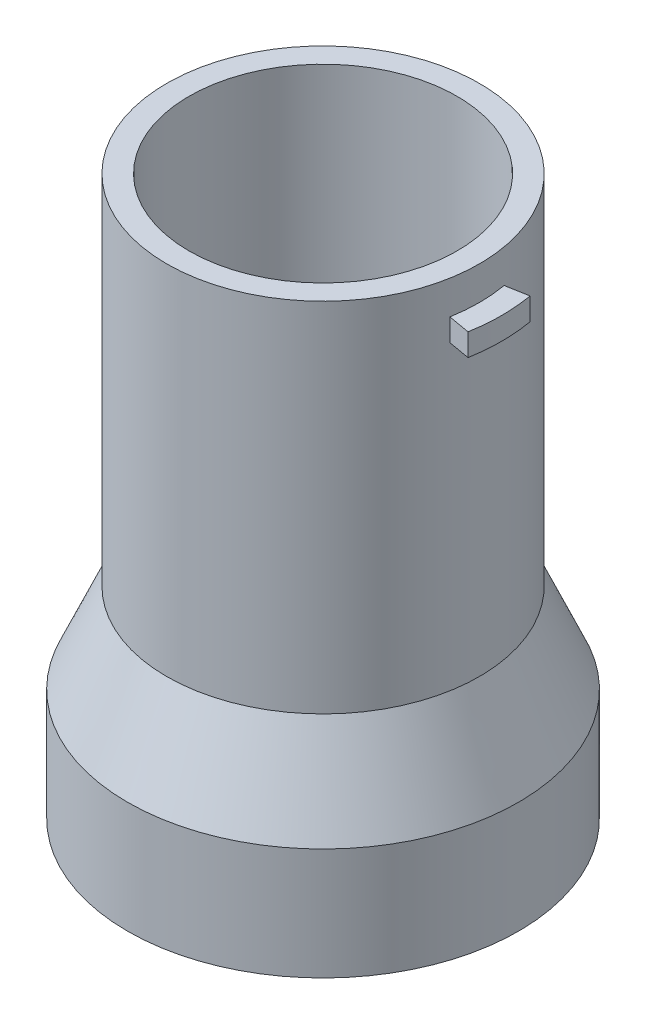
ISO-10303-21;
HEADER;
FILE_DESCRIPTION(('STEP AP214'),'2;1');
FILE_NAME('part.step','',(''),(''),'','','');
FILE_SCHEMA(('AUTOMOTIVE_DESIGN { 1 0 10303 214 1 1 1 1 }'));
ENDSEC;
DATA;
#1=APPLICATION_CONTEXT('core data for automotive mechanical design processes');
#2=APPLICATION_PROTOCOL_DEFINITION('international standard','automotive_design',2000,#1);
#3=PRODUCT_CONTEXT('',#1,'mechanical');
#4=PRODUCT('Part','Part','',(#3));
#5=PRODUCT_RELATED_PRODUCT_CATEGORY('part','',(#4));
#6=PRODUCT_DEFINITION_FORMATION('','',#4);
#7=PRODUCT_DEFINITION_CONTEXT('part definition',#1,'design');
#8=PRODUCT_DEFINITION('design','',#6,#7);
#9=PRODUCT_DEFINITION_SHAPE('','',#8);
#10=(LENGTH_UNIT() NAMED_UNIT(*) SI_UNIT(.MILLI.,.METRE.));
#11=(NAMED_UNIT(*) PLANE_ANGLE_UNIT() SI_UNIT($,.RADIAN.));
#12=(NAMED_UNIT(*) SI_UNIT($,.STERADIAN.) SOLID_ANGLE_UNIT());
#13=UNCERTAINTY_MEASURE_WITH_UNIT(LENGTH_MEASURE(1.E-05),#10,'distance_accuracy_value','');
#14=(GEOMETRIC_REPRESENTATION_CONTEXT(3) GLOBAL_UNCERTAINTY_ASSIGNED_CONTEXT((#13)) GLOBAL_UNIT_ASSIGNED_CONTEXT((#10,
#11,#12)) REPRESENTATION_CONTEXT('',''));
#15=CARTESIAN_POINT('',(0.,0.,0.));
#16=DIRECTION('',(0.,0.,1.));
#17=DIRECTION('',(1.,0.,0.));
#18=AXIS2_PLACEMENT_3D('',#15,#16,#17);
#19=CARTESIAN_POINT('',(0.,40.467735012162,0.));
#20=DIRECTION('',(0.,1.,0.));
#21=DIRECTION('',(0.,0.,1.));
#22=AXIS2_PLACEMENT_3D('',#19,#20,#21);
#23=CYLINDRICAL_SURFACE('',#22,14.5);
#24=DIRECTION('',(0.,-1.,0.));
#25=VECTOR('',#24,1.);
#26=CARTESIAN_POINT('',(14.156292103239,-25.,-3.1383744021025));
#27=LINE('',#26,#25);
#28=CARTESIAN_POINT('',(14.156292103239,-20.7,-3.1383744021025));
#29=VERTEX_POINT('',#28);
#30=CARTESIAN_POINT('',(14.156292103239,-25.,-3.1383744021025));
#31=VERTEX_POINT('',#30);
#32=EDGE_CURVE('E57',#29,#31,#27,.T.);
#33=ORIENTED_EDGE('',*,*,#32,.F.);
#34=CARTESIAN_POINT('',(0.,-20.7,0.));
#35=DIRECTION('',(0.,-1.,0.));
#36=DIRECTION('',(0.,0.,-1.));
#37=AXIS2_PLACEMENT_3D('',#34,#35,#36);
#38=CIRCLE('',#37,14.5);
#39=CARTESIAN_POINT('',(10.2530483272049,-20.7,-10.253048327205));
#40=VERTEX_POINT('',#39);
#41=EDGE_CURVE('E189',#29,#40,#38,.F.);
#42=ORIENTED_EDGE('',*,*,#41,.T.);
#43=DIRECTION('',(0.,1.,0.));
#44=VECTOR('',#43,1.);
#45=CARTESIAN_POINT('',(10.2530483272049,40.467735012162,-10.253048327205));
#46=LINE('',#45,#44);
#47=CARTESIAN_POINT('',(10.2530483272049,-18.2,-10.253048327205));
#48=VERTEX_POINT('',#47);
#49=EDGE_CURVE('E11',#48,#40,#46,.F.);
#50=ORIENTED_EDGE('',*,*,#49,.F.);
#51=CARTESIAN_POINT('',(0.,-18.2,0.));
#52=DIRECTION('',(0.,1.,0.));
#53=DIRECTION('',(0.,0.,1.));
#54=AXIS2_PLACEMENT_3D('',#51,#52,#53);
#55=CIRCLE('',#54,14.5);
#56=CARTESIAN_POINT('',(14.156292103239,-18.2,3.1383744021025));
#57=VERTEX_POINT('',#56);
#58=EDGE_CURVE('E229',#57,#48,#55,.T.);
#59=ORIENTED_EDGE('',*,*,#58,.F.);
#60=DIRECTION('',(0.,-1.,0.));
#61=VECTOR('',#60,1.);
#62=CARTESIAN_POINT('',(14.156292103239,-25.,3.1383744021025));
#63=LINE('',#62,#61);
#64=CARTESIAN_POINT('',(14.156292103239,-25.,3.1383744021025));
#65=VERTEX_POINT('',#64);
#66=EDGE_CURVE('E220',#57,#65,#63,.T.);
#67=ORIENTED_EDGE('',*,*,#66,.T.);
#68=CARTESIAN_POINT('',(0.,-25.,0.));
#69=DIRECTION('',(0.,1.,0.));
#70=DIRECTION('',(0.,0.,1.));
#71=AXIS2_PLACEMENT_3D('',#68,#69,#70);
#72=CIRCLE('',#71,14.5);
#73=CARTESIAN_POINT('',(-14.156292103239,-25.,3.1383744021025));
#74=VERTEX_POINT('',#73);
#75=EDGE_CURVE('E336',#74,#65,#72,.T.);
#76=ORIENTED_EDGE('',*,*,#75,.F.);
#77=DIRECTION('',(0.,1.,0.));
#78=VECTOR('',#77,1.);
#79=CARTESIAN_POINT('',(-14.156292103239,-18.2,3.1383744021025));
#80=LINE('',#79,#78);
#81=CARTESIAN_POINT('',(-14.156292103239,-20.7,3.1383744021025));
#82=VERTEX_POINT('',#81);
#83=EDGE_CURVE('E237',#74,#82,#80,.T.);
#84=ORIENTED_EDGE('',*,*,#83,.T.);
#85=CARTESIAN_POINT('',(0.,-20.7,0.));
#86=DIRECTION('',(0.,1.,0.));
#87=DIRECTION('',(0.,0.,1.));
#88=AXIS2_PLACEMENT_3D('',#85,#86,#87);
#89=CIRCLE('',#88,14.5);
#90=CARTESIAN_POINT('',(-10.2530483272049,-20.7,10.253048327205));
#91=VERTEX_POINT('',#90);
#92=EDGE_CURVE('E49',#91,#82,#89,.F.);
#93=ORIENTED_EDGE('',*,*,#92,.F.);
#94=DIRECTION('',(0.,1.,0.));
#95=VECTOR('',#94,1.);
#96=CARTESIAN_POINT('',(-10.2530483272049,40.467735012162,10.253048327205));
#97=LINE('',#96,#95);
#98=CARTESIAN_POINT('',(-10.2530483272049,-18.2,10.253048327205));
#99=VERTEX_POINT('',#98);
#100=EDGE_CURVE('E350',#91,#99,#97,.T.);
#101=ORIENTED_EDGE('',*,*,#100,.T.);
#102=CARTESIAN_POINT('',(0.,-18.2,0.));
#103=DIRECTION('',(0.,1.,0.));
#104=DIRECTION('',(0.,0.,1.));
#105=AXIS2_PLACEMENT_3D('',#102,#103,#104);
#106=CIRCLE('',#105,14.5);
#107=CARTESIAN_POINT('',(-14.156292103239,-18.2,-3.1383744021025));
#108=VERTEX_POINT('',#107);
#109=EDGE_CURVE('E253',#108,#99,#106,.T.);
#110=ORIENTED_EDGE('',*,*,#109,.F.);
#111=DIRECTION('',(0.,1.,0.));
#112=VECTOR('',#111,1.);
#113=CARTESIAN_POINT('',(-14.156292103239,-18.2,-3.1383744021025));
#114=LINE('',#113,#112);
#115=CARTESIAN_POINT('',(-14.156292103239,-25.,-3.1383744021025));
#116=VERTEX_POINT('',#115);
#117=EDGE_CURVE('E246',#116,#108,#114,.T.);
#118=ORIENTED_EDGE('',*,*,#117,.F.);
#119=EDGE_CURVE('E335',#31,#116,#72,.T.);
#120=ORIENTED_EDGE('',*,*,#119,.F.);
#121=EDGE_LOOP('',(#33,#42,#50,#59,#67,#76,#84,#93,#101,#110,#118,#120));
#122=FACE_BOUND('',#121,.T.);
#123=CARTESIAN_POINT('',(0.,-15.,0.));
#124=DIRECTION('',(0.,1.,0.));
#125=DIRECTION('',(0.,0.,1.));
#126=AXIS2_PLACEMENT_3D('',#123,#124,#125);
#127=CIRCLE('',#126,14.5);
#128=CARTESIAN_POINT('',(0.,-15.,14.5));
#129=VERTEX_POINT('',#128);
#130=EDGE_CURVE('E339',#129,#129,#127,.T.);
#131=ORIENTED_EDGE('',*,*,#130,.T.);
#132=EDGE_LOOP('',(#131));
#133=FACE_BOUND('',#132,.T.);
#134=ADVANCED_FACE('F34',(#122,#133),#23,.F.);
#135=CARTESIAN_POINT('',(-16.3041433189029,-25.,3.61454155276633));
#136=DIRECTION('',(0.216439613938103,0.,0.976296007119933));
#137=DIRECTION('',(0.976296007119933,0.,-0.216439613938103));
#138=AXIS2_PLACEMENT_3D('',#135,#136,#137);
#139=PLANE('',#138);
#140=DIRECTION('',(-0.976296007119933,0.,0.216439613938103));
#141=VECTOR('',#140,1.);
#142=CARTESIAN_POINT('',(-16.3041433189029,-20.7,3.61454155276633));
#143=LINE('',#142,#141);
#144=CARTESIAN_POINT('',(-16.3041433189029,-20.7,3.61454155276633));
#145=VERTEX_POINT('',#144);
#146=EDGE_CURVE('E348',#82,#145,#143,.T.);
#147=ORIENTED_EDGE('',*,*,#146,.F.);
#148=ORIENTED_EDGE('',*,*,#83,.F.);
#149=DIRECTION('',(0.976296007119933,0.,-0.216439613938103));
#150=VECTOR('',#149,1.);
#151=CARTESIAN_POINT('',(-16.3041433189029,-25.,3.61454155276633));
#152=LINE('',#151,#150);
#153=CARTESIAN_POINT('',(-16.3041433189029,-25.,3.61454155276633));
#154=VERTEX_POINT('',#153);
#155=EDGE_CURVE('E234',#154,#74,#152,.T.);
#156=ORIENTED_EDGE('',*,*,#155,.F.);
#157=DIRECTION('',(0.,-1.,0.));
#158=VECTOR('',#157,1.);
#159=CARTESIAN_POINT('',(-16.3041433189029,-18.2,3.61454155276633));
#160=LINE('',#159,#158);
#161=EDGE_CURVE('E232',#145,#154,#160,.T.);
#162=ORIENTED_EDGE('',*,*,#161,.F.);
#163=EDGE_LOOP('',(#147,#148,#156,#162));
#164=FACE_BOUND('',#163,.T.);
#165=ADVANCED_FACE('F396',(#164),#139,.F.);
#166=CARTESIAN_POINT('',(14.5,-25.,0.));
#167=DIRECTION('',(0.,1.,0.));
#168=DIRECTION('',(0.,0.,1.));
#169=AXIS2_PLACEMENT_3D('',#166,#167,#168);
#170=PLANE('',#169);
#171=CARTESIAN_POINT('',(0.,-25.,0.));
#172=DIRECTION('',(0.,1.,0.));
#173=DIRECTION('',(0.,0.,1.));
#174=AXIS2_PLACEMENT_3D('',#171,#172,#173);
#175=CIRCLE('',#174,17.5);
#176=CARTESIAN_POINT('',(0.,-25.,17.5));
#177=VERTEX_POINT('',#176);
#178=EDGE_CURVE('E332',#177,#177,#175,.T.);
#179=ORIENTED_EDGE('',*,*,#178,.F.);
#180=EDGE_LOOP('',(#179));
#181=FACE_BOUND('',#180,.T.);
#182=ORIENTED_EDGE('',*,*,#75,.T.);
#183=DIRECTION('',(0.976296007119933,0.,0.216439613938103));
#184=VECTOR('',#183,1.);
#185=CARTESIAN_POINT('',(16.3041433189029,-25.,3.61454155276633));
#186=LINE('',#185,#184);
#187=CARTESIAN_POINT('',(16.3041433189029,-25.,3.61454155276633));
#188=VERTEX_POINT('',#187);
#189=EDGE_CURVE('E223',#65,#188,#186,.T.);
#190=ORIENTED_EDGE('',*,*,#189,.T.);
#191=CARTESIAN_POINT('',(0.,-25.,0.));
#192=DIRECTION('',(0.,1.,0.));
#193=DIRECTION('',(0.,0.,1.));
#194=AXIS2_PLACEMENT_3D('',#191,#192,#193);
#195=CIRCLE('',#194,16.7);
#196=CARTESIAN_POINT('',(16.3041433189029,-25.,-3.61454155276633));
#197=VERTEX_POINT('',#196);
#198=EDGE_CURVE('E226',#188,#197,#195,.T.);
#199=ORIENTED_EDGE('',*,*,#198,.T.);
#200=DIRECTION('',(0.976296007119933,0.,-0.216439613938103));
#201=VECTOR('',#200,1.);
#202=CARTESIAN_POINT('',(16.3041433189029,-25.,-3.61454155276633));
#203=LINE('',#202,#201);
#204=EDGE_CURVE('E214',#31,#197,#203,.T.);
#205=ORIENTED_EDGE('',*,*,#204,.F.);
#206=ORIENTED_EDGE('',*,*,#119,.T.);
#207=DIRECTION('',(0.976296007119933,0.,0.216439613938103));
#208=VECTOR('',#207,1.);
#209=CARTESIAN_POINT('',(-16.3041433189029,-25.,-3.61454155276633));
#210=LINE('',#209,#208);
#211=CARTESIAN_POINT('',(-16.3041433189029,-25.,-3.61454155276633));
#212=VERTEX_POINT('',#211);
#213=EDGE_CURVE('E243',#212,#116,#210,.T.);
#214=ORIENTED_EDGE('',*,*,#213,.F.);
#215=CARTESIAN_POINT('',(0.,-25.,0.));
#216=DIRECTION('',(0.,1.,0.));
#217=DIRECTION('',(0.,0.,1.));
#218=AXIS2_PLACEMENT_3D('',#215,#216,#217);
#219=CIRCLE('',#218,16.7);
#220=EDGE_CURVE('E255',#212,#154,#219,.T.);
#221=ORIENTED_EDGE('',*,*,#220,.T.);
#222=ORIENTED_EDGE('',*,*,#155,.T.);
#223=EDGE_LOOP('',(#182,#190,#199,#205,#206,#214,#221,#222));
#224=FACE_BOUND('',#223,.T.);
#225=ADVANCED_FACE('F374',(#181,#224),#170,.F.);
#226=CARTESIAN_POINT('',(0.,40.467735012162,0.));
#227=DIRECTION('',(0.,1.,0.));
#228=DIRECTION('',(0.,0.,1.));
#229=AXIS2_PLACEMENT_3D('',#226,#227,#228);
#230=CYLINDRICAL_SURFACE('',#229,14.);
#231=CARTESIAN_POINT('',(0.,20.,0.));
#232=DIRECTION('',(0.,1.,0.));
#233=DIRECTION('',(0.,0.,1.));
#234=AXIS2_PLACEMENT_3D('',#231,#232,#233);
#235=CIRCLE('',#234,14.);
#236=CARTESIAN_POINT('',(-13.7873085421709,20.,-2.43107448733703));
#237=VERTEX_POINT('',#236);
#238=CARTESIAN_POINT('',(-13.7873085421709,20.,2.43107448733703));
#239=VERTEX_POINT('',#238);
#240=EDGE_CURVE('E285',#237,#239,#235,.T.);
#241=ORIENTED_EDGE('',*,*,#240,.F.);
#242=DIRECTION('',(0.,1.,0.));
#243=VECTOR('',#242,1.);
#244=CARTESIAN_POINT('',(-13.7873085421709,22.,-2.43107448733703));
#245=LINE('',#244,#243);
#246=CARTESIAN_POINT('',(-13.7873085421709,22.,-2.43107448733703));
#247=VERTEX_POINT('',#246);
#248=EDGE_CURVE('E279',#237,#247,#245,.T.);
#249=ORIENTED_EDGE('',*,*,#248,.T.);
#250=CARTESIAN_POINT('',(0.,22.,0.));
#251=DIRECTION('',(0.,1.,0.));
#252=DIRECTION('',(0.,0.,1.));
#253=AXIS2_PLACEMENT_3D('',#250,#251,#252);
#254=CIRCLE('',#253,14.);
#255=CARTESIAN_POINT('',(-13.7873085421709,22.,2.43107448733703));
#256=VERTEX_POINT('',#255);
#257=EDGE_CURVE('E288',#247,#256,#254,.T.);
#258=ORIENTED_EDGE('',*,*,#257,.T.);
#259=DIRECTION('',(0.,1.,0.));
#260=VECTOR('',#259,1.);
#261=CARTESIAN_POINT('',(-13.7873085421709,22.,2.43107448733703));
#262=LINE('',#261,#260);
#263=EDGE_CURVE('E267',#239,#256,#262,.T.);
#264=ORIENTED_EDGE('',*,*,#263,.F.);
#265=EDGE_LOOP('',(#241,#249,#258,#264));
#266=FACE_BOUND('',#265,.T.);
#267=CARTESIAN_POINT('',(0.,-7.,0.));
#268=DIRECTION('',(0.,1.,0.));
#269=DIRECTION('',(0.,0.,1.));
#270=AXIS2_PLACEMENT_3D('',#267,#268,#269);
#271=CIRCLE('',#270,14.);
#272=CARTESIAN_POINT('',(0.,-7.,14.));
#273=VERTEX_POINT('',#272);
#274=EDGE_CURVE('E326',#273,#273,#271,.T.);
#275=ORIENTED_EDGE('',*,*,#274,.T.);
#276=EDGE_LOOP('',(#275));
#277=FACE_BOUND('',#276,.T.);
#278=CARTESIAN_POINT('',(0.,25.,0.));
#279=DIRECTION('',(0.,1.,0.));
#280=DIRECTION('',(0.,0.,1.));
#281=AXIS2_PLACEMENT_3D('',#278,#279,#280);
#282=CIRCLE('',#281,14.);
#283=CARTESIAN_POINT('',(0.,25.,14.));
#284=VERTEX_POINT('',#283);
#285=EDGE_CURVE('E323',#284,#284,#282,.T.);
#286=ORIENTED_EDGE('',*,*,#285,.F.);
#287=EDGE_LOOP('',(#286));
#288=FACE_BOUND('',#287,.T.);
#289=DIRECTION('',(0.,-1.,0.));
#290=VECTOR('',#289,1.);
#291=CARTESIAN_POINT('',(13.7873085421709,20.,2.43107448733703));
#292=LINE('',#291,#290);
#293=CARTESIAN_POINT('',(13.7873085421709,22.,2.43107448733703));
#294=VERTEX_POINT('',#293);
#295=CARTESIAN_POINT('',(13.7873085421709,20.,2.43107448733703));
#296=VERTEX_POINT('',#295);
#297=EDGE_CURVE('E301',#294,#296,#292,.T.);
#298=ORIENTED_EDGE('',*,*,#297,.F.);
#299=CARTESIAN_POINT('',(0.,22.,0.));
#300=DIRECTION('',(0.,1.,0.));
#301=DIRECTION('',(0.,0.,1.));
#302=AXIS2_PLACEMENT_3D('',#299,#300,#301);
#303=CIRCLE('',#302,14.);
#304=CARTESIAN_POINT('',(13.7873085421709,22.,-2.43107448733703));
#305=VERTEX_POINT('',#304);
#306=EDGE_CURVE('E320',#294,#305,#303,.T.);
#307=ORIENTED_EDGE('',*,*,#306,.T.);
#308=DIRECTION('',(0.,-1.,0.));
#309=VECTOR('',#308,1.);
#310=CARTESIAN_POINT('',(13.7873085421709,20.,-2.43107448733703));
#311=LINE('',#310,#309);
#312=CARTESIAN_POINT('',(13.7873085421709,20.,-2.43107448733703));
#313=VERTEX_POINT('',#312);
#314=EDGE_CURVE('E290',#305,#313,#311,.T.);
#315=ORIENTED_EDGE('',*,*,#314,.T.);
#316=CARTESIAN_POINT('',(0.,20.,0.));
#317=DIRECTION('',(0.,1.,0.));
#318=DIRECTION('',(0.,0.,1.));
#319=AXIS2_PLACEMENT_3D('',#316,#317,#318);
#320=CIRCLE('',#319,14.);
#321=EDGE_CURVE('E313',#296,#313,#320,.T.);
#322=ORIENTED_EDGE('',*,*,#321,.F.);
#323=EDGE_LOOP('',(#298,#307,#315,#322));
#324=FACE_BOUND('',#323,.T.);
#325=ADVANCED_FACE('F415',(#266,#277,#288,#324),#230,.T.);
#326=CARTESIAN_POINT('',(14.,25.,0.));
#327=DIRECTION('',(0.,-1.,0.));
#328=DIRECTION('',(0.,0.,-1.));
#329=AXIS2_PLACEMENT_3D('',#326,#327,#328);
#330=PLANE('',#329);
#331=CARTESIAN_POINT('',(0.,25.,0.));
#332=DIRECTION('',(0.,1.,0.));
#333=DIRECTION('',(0.,0.,1.));
#334=AXIS2_PLACEMENT_3D('',#331,#332,#333);
#335=CIRCLE('',#334,12.);
#336=CARTESIAN_POINT('',(0.,25.,12.));
#337=VERTEX_POINT('',#336);
#338=EDGE_CURVE('E345',#337,#337,#335,.T.);
#339=ORIENTED_EDGE('',*,*,#338,.F.);
#340=EDGE_LOOP('',(#339));
#341=FACE_BOUND('',#340,.T.);
#342=ORIENTED_EDGE('',*,*,#285,.T.);
#343=EDGE_LOOP('',(#342));
#344=FACE_BOUND('',#343,.T.);
#345=ADVANCED_FACE('F36',(#341,#344),#330,.F.);
#346=CARTESIAN_POINT('',(0.,40.467735012162,0.));
#347=DIRECTION('',(0.,1.,0.));
#348=DIRECTION('',(0.,0.,1.));
#349=AXIS2_PLACEMENT_3D('',#346,#347,#348);
#350=CYLINDRICAL_SURFACE('',#349,12.);
#351=CARTESIAN_POINT('',(0.,-15.,0.));
#352=DIRECTION('',(0.,1.,0.));
#353=DIRECTION('',(0.,0.,1.));
#354=AXIS2_PLACEMENT_3D('',#351,#352,#353);
#355=CIRCLE('',#354,12.);
#356=CARTESIAN_POINT('',(0.,-15.,12.));
#357=VERTEX_POINT('',#356);
#358=EDGE_CURVE('E342',#357,#357,#355,.T.);
#359=ORIENTED_EDGE('',*,*,#358,.F.);
#360=EDGE_LOOP('',(#359));
#361=FACE_BOUND('',#360,.T.);
#362=ORIENTED_EDGE('',*,*,#338,.T.);
#363=EDGE_LOOP('',(#362));
#364=FACE_BOUND('',#363,.T.);
#365=ADVANCED_FACE('F408',(#361,#364),#350,.F.);
#366=CARTESIAN_POINT('',(12.,-15.,0.));
#367=DIRECTION('',(0.,1.,0.));
#368=DIRECTION('',(0.,0.,1.));
#369=AXIS2_PLACEMENT_3D('',#366,#367,#368);
#370=PLANE('',#369);
#371=ORIENTED_EDGE('',*,*,#130,.F.);
#372=EDGE_LOOP('',(#371));
#373=FACE_BOUND('',#372,.T.);
#374=ORIENTED_EDGE('',*,*,#358,.T.);
#375=EDGE_LOOP('',(#374));
#376=FACE_BOUND('',#375,.T.);
#377=ADVANCED_FACE('F405',(#373,#376),#370,.F.);
#378=CARTESIAN_POINT('',(0.,40.467735012162,0.));
#379=DIRECTION('',(0.,1.,0.));
#380=DIRECTION('',(0.,0.,1.));
#381=AXIS2_PLACEMENT_3D('',#378,#379,#380);
#382=CYLINDRICAL_SURFACE('',#381,17.5);
#383=CARTESIAN_POINT('',(0.,-15.,0.));
#384=DIRECTION('',(0.,1.,0.));
#385=DIRECTION('',(0.,0.,1.));
#386=AXIS2_PLACEMENT_3D('',#383,#384,#385);
#387=CIRCLE('',#386,17.5);
#388=CARTESIAN_POINT('',(0.,-15.,17.5));
#389=VERTEX_POINT('',#388);
#390=EDGE_CURVE('E329',#389,#389,#387,.T.);
#391=ORIENTED_EDGE('',*,*,#390,.F.);
#392=EDGE_LOOP('',(#391));
#393=FACE_BOUND('',#392,.T.);
#394=ORIENTED_EDGE('',*,*,#178,.T.);
#395=EDGE_LOOP('',(#394));
#396=FACE_BOUND('',#395,.T.);
#397=ADVANCED_FACE('F407',(#393,#396),#382,.T.);
#398=CARTESIAN_POINT('',(0.,-15.,0.));
#399=DIRECTION('',(0.,-1.,0.));
#400=DIRECTION('',(0.,0.,-1.));
#401=AXIS2_PLACEMENT_3D('',#398,#399,#400);
#402=CONICAL_SURFACE('',#401,17.5,0.412410441597386);
#403=ORIENTED_EDGE('',*,*,#274,.F.);
#404=EDGE_LOOP('',(#403));
#405=FACE_BOUND('',#404,.T.);
#406=ORIENTED_EDGE('',*,*,#390,.T.);
#407=EDGE_LOOP('',(#406));
#408=FACE_BOUND('',#407,.T.);
#409=ADVANCED_FACE('F451',(#405,#408),#402,.T.);
#410=CARTESIAN_POINT('',(13.7873085421709,22.,2.43107448733703));
#411=DIRECTION('',(0.,-1.,0.));
#412=DIRECTION('',(0.,0.,-1.));
#413=AXIS2_PLACEMENT_3D('',#410,#411,#412);
#414=PLANE('',#413);
#415=CARTESIAN_POINT('',(0.,22.,0.));
#416=DIRECTION('',(0.,1.,0.));
#417=DIRECTION('',(0.,0.,1.));
#418=AXIS2_PLACEMENT_3D('',#415,#416,#417);
#419=CIRCLE('',#418,16.);
#420=CARTESIAN_POINT('',(15.7569240481953,22.,2.77837084267089));
#421=VERTEX_POINT('',#420);
#422=CARTESIAN_POINT('',(15.7569240481953,22.,-2.77837084267089));
#423=VERTEX_POINT('',#422);
#424=EDGE_CURVE('E318',#421,#423,#419,.T.);
#425=ORIENTED_EDGE('',*,*,#424,.T.);
#426=DIRECTION('',(-0.984807753012208,0.,0.173648177666931));
#427=VECTOR('',#426,1.);
#428=CARTESIAN_POINT('',(13.7873085421709,22.,-2.43107448733703));
#429=LINE('',#428,#427);
#430=EDGE_CURVE('E299',#423,#305,#429,.T.);
#431=ORIENTED_EDGE('',*,*,#430,.T.);
#432=ORIENTED_EDGE('',*,*,#306,.F.);
#433=DIRECTION('',(-0.984807753012208,0.,-0.173648177666931));
#434=VECTOR('',#433,1.);
#435=CARTESIAN_POINT('',(13.7873085421709,22.,2.43107448733703));
#436=LINE('',#435,#434);
#437=EDGE_CURVE('E310',#421,#294,#436,.T.);
#438=ORIENTED_EDGE('',*,*,#437,.F.);
#439=EDGE_LOOP('',(#425,#431,#432,#438));
#440=FACE_BOUND('',#439,.T.);
#441=ADVANCED_FACE('F434',(#440),#414,.F.);
#442=CARTESIAN_POINT('',(0.,45.3066617431812,0.));
#443=DIRECTION('',(0.,1.,0.));
#444=DIRECTION('',(0.,0.,1.));
#445=AXIS2_PLACEMENT_3D('',#442,#443,#444);
#446=CYLINDRICAL_SURFACE('',#445,16.);
#447=CARTESIAN_POINT('',(0.,20.,0.));
#448=DIRECTION('',(0.,1.,0.));
#449=DIRECTION('',(0.,0.,1.));
#450=AXIS2_PLACEMENT_3D('',#447,#448,#449);
#451=CIRCLE('',#450,16.);
#452=CARTESIAN_POINT('',(15.7569240481953,20.,2.77837084267089));
#453=VERTEX_POINT('',#452);
#454=CARTESIAN_POINT('',(15.7569240481953,20.,-2.77837084267089));
#455=VERTEX_POINT('',#454);
#456=EDGE_CURVE('E316',#453,#455,#451,.T.);
#457=ORIENTED_EDGE('',*,*,#456,.T.);
#458=DIRECTION('',(0.,1.,0.));
#459=VECTOR('',#458,1.);
#460=CARTESIAN_POINT('',(15.7569240481953,22.,-2.77837084267089));
#461=LINE('',#460,#459);
#462=EDGE_CURVE('E296',#455,#423,#461,.T.);
#463=ORIENTED_EDGE('',*,*,#462,.T.);
#464=ORIENTED_EDGE('',*,*,#424,.F.);
#465=DIRECTION('',(0.,1.,0.));
#466=VECTOR('',#465,1.);
#467=CARTESIAN_POINT('',(15.7569240481953,22.,2.77837084267089));
#468=LINE('',#467,#466);
#469=EDGE_CURVE('E307',#453,#421,#468,.T.);
#470=ORIENTED_EDGE('',*,*,#469,.F.);
#471=EDGE_LOOP('',(#457,#463,#464,#470));
#472=FACE_BOUND('',#471,.T.);
#473=ADVANCED_FACE('F443',(#472),#446,.T.);
#474=CARTESIAN_POINT('',(15.7569240481953,20.,2.77837084267089));
#475=DIRECTION('',(0.,1.,0.));
#476=DIRECTION('',(0.,0.,1.));
#477=AXIS2_PLACEMENT_3D('',#474,#475,#476);
#478=PLANE('',#477);
#479=DIRECTION('',(0.984807753012208,0.,0.173648177666931));
#480=VECTOR('',#479,1.);
#481=CARTESIAN_POINT('',(15.7569240481953,20.,2.77837084267089));
#482=LINE('',#481,#480);
#483=EDGE_CURVE('E304',#296,#453,#482,.T.);
#484=ORIENTED_EDGE('',*,*,#483,.F.);
#485=ORIENTED_EDGE('',*,*,#321,.T.);
#486=DIRECTION('',(0.984807753012208,0.,-0.173648177666931));
#487=VECTOR('',#486,1.);
#488=CARTESIAN_POINT('',(15.7569240481953,20.,-2.77837084267089));
#489=LINE('',#488,#487);
#490=EDGE_CURVE('E293',#313,#455,#489,.T.);
#491=ORIENTED_EDGE('',*,*,#490,.T.);
#492=ORIENTED_EDGE('',*,*,#456,.F.);
#493=EDGE_LOOP('',(#484,#485,#491,#492));
#494=FACE_BOUND('',#493,.T.);
#495=ADVANCED_FACE('F441',(#494),#478,.F.);
#496=CARTESIAN_POINT('',(13.7873085421709,22.,2.43107448733703));
#497=DIRECTION('',(0.173648177666931,0.,-0.984807753012208));
#498=DIRECTION('',(-0.984807753012208,0.,-0.173648177666931));
#499=AXIS2_PLACEMENT_3D('',#496,#497,#498);
#500=PLANE('',#499);
#501=ORIENTED_EDGE('',*,*,#297,.T.);
#502=ORIENTED_EDGE('',*,*,#483,.T.);
#503=ORIENTED_EDGE('',*,*,#469,.T.);
#504=ORIENTED_EDGE('',*,*,#437,.T.);
#505=EDGE_LOOP('',(#501,#502,#503,#504));
#506=FACE_BOUND('',#505,.T.);
#507=ADVANCED_FACE('F430',(#506),#500,.F.);
#508=CARTESIAN_POINT('',(13.7873085421709,22.,-2.43107448733703));
#509=DIRECTION('',(-0.173648177666931,0.,-0.984807753012208));
#510=DIRECTION('',(-0.984807753012208,0.,0.173648177666931));
#511=AXIS2_PLACEMENT_3D('',#508,#509,#510);
#512=PLANE('',#511);
#513=ORIENTED_EDGE('',*,*,#314,.F.);
#514=ORIENTED_EDGE('',*,*,#430,.F.);
#515=ORIENTED_EDGE('',*,*,#462,.F.);
#516=ORIENTED_EDGE('',*,*,#490,.F.);
#517=EDGE_LOOP('',(#513,#514,#515,#516));
#518=FACE_BOUND('',#517,.T.);
#519=ADVANCED_FACE('F439',(#518),#512,.T.);
#520=CARTESIAN_POINT('',(-15.7569240481953,22.,-2.77837084267089));
#521=DIRECTION('',(0.,1.,0.));
#522=DIRECTION('',(0.,0.,1.));
#523=AXIS2_PLACEMENT_3D('',#520,#521,#522);
#524=PLANE('',#523);
#525=ORIENTED_EDGE('',*,*,#257,.F.);
#526=DIRECTION('',(-0.984807753012208,0.,-0.173648177666931));
#527=VECTOR('',#526,1.);
#528=CARTESIAN_POINT('',(-15.7569240481953,22.,-2.77837084267089));
#529=LINE('',#528,#527);
#530=CARTESIAN_POINT('',(-15.7569240481953,22.,-2.77837084267089));
#531=VERTEX_POINT('',#530);
#532=EDGE_CURVE('E270',#247,#531,#529,.T.);
#533=ORIENTED_EDGE('',*,*,#532,.T.);
#534=CARTESIAN_POINT('',(0.,22.,0.));
#535=DIRECTION('',(0.,1.,0.));
#536=DIRECTION('',(0.,0.,1.));
#537=AXIS2_PLACEMENT_3D('',#534,#535,#536);
#538=CIRCLE('',#537,16.);
#539=CARTESIAN_POINT('',(-15.7569240481953,22.,2.77837084267089));
#540=VERTEX_POINT('',#539);
#541=EDGE_CURVE('E281',#531,#540,#538,.T.);
#542=ORIENTED_EDGE('',*,*,#541,.T.);
#543=DIRECTION('',(-0.984807753012208,0.,0.173648177666931));
#544=VECTOR('',#543,1.);
#545=CARTESIAN_POINT('',(-15.7569240481953,22.,2.77837084267089));
#546=LINE('',#545,#544);
#547=EDGE_CURVE('E258',#256,#540,#546,.T.);
#548=ORIENTED_EDGE('',*,*,#547,.F.);
#549=EDGE_LOOP('',(#525,#533,#542,#548));
#550=FACE_BOUND('',#549,.T.);
#551=ADVANCED_FACE('F532',(#550),#524,.T.);
#552=CARTESIAN_POINT('',(-13.7873085421709,20.,-2.43107448733703));
#553=DIRECTION('',(0.,-1.,0.));
#554=DIRECTION('',(0.,0.,-1.));
#555=AXIS2_PLACEMENT_3D('',#552,#553,#554);
#556=PLANE('',#555);
#557=CARTESIAN_POINT('',(0.,20.,0.));
#558=DIRECTION('',(0.,1.,0.));
#559=DIRECTION('',(0.,0.,1.));
#560=AXIS2_PLACEMENT_3D('',#557,#558,#559);
#561=CIRCLE('',#560,16.);
#562=CARTESIAN_POINT('',(-15.7569240481953,20.,-2.77837084267089));
#563=VERTEX_POINT('',#562);
#564=CARTESIAN_POINT('',(-15.7569240481953,20.,2.77837084267089));
#565=VERTEX_POINT('',#564);
#566=EDGE_CURVE('E283',#563,#565,#561,.T.);
#567=ORIENTED_EDGE('',*,*,#566,.F.);
#568=DIRECTION('',(0.984807753012208,0.,0.173648177666931));
#569=VECTOR('',#568,1.);
#570=CARTESIAN_POINT('',(-13.7873085421709,20.,-2.43107448733703));
#571=LINE('',#570,#569);
#572=EDGE_CURVE('E276',#563,#237,#571,.T.);
#573=ORIENTED_EDGE('',*,*,#572,.T.);
#574=ORIENTED_EDGE('',*,*,#240,.T.);
#575=DIRECTION('',(0.984807753012208,0.,-0.173648177666931));
#576=VECTOR('',#575,1.);
#577=CARTESIAN_POINT('',(-13.7873085421709,20.,2.43107448733703));
#578=LINE('',#577,#576);
#579=EDGE_CURVE('E264',#565,#239,#578,.T.);
#580=ORIENTED_EDGE('',*,*,#579,.F.);
#581=EDGE_LOOP('',(#567,#573,#574,#580));
#582=FACE_BOUND('',#581,.T.);
#583=ADVANCED_FACE('F541',(#582),#556,.T.);
#584=CARTESIAN_POINT('',(0.,45.3066617431812,0.));
#585=DIRECTION('',(0.,1.,0.));
#586=DIRECTION('',(0.,0.,1.));
#587=AXIS2_PLACEMENT_3D('',#584,#585,#586);
#588=CYLINDRICAL_SURFACE('',#587,16.);
#589=DIRECTION('',(0.,-1.,0.));
#590=VECTOR('',#589,1.);
#591=CARTESIAN_POINT('',(-15.7569240481953,20.,-2.77837084267089));
#592=LINE('',#591,#590);
#593=EDGE_CURVE('E273',#531,#563,#592,.T.);
#594=ORIENTED_EDGE('',*,*,#593,.T.);
#595=ORIENTED_EDGE('',*,*,#566,.T.);
#596=DIRECTION('',(0.,-1.,0.));
#597=VECTOR('',#596,1.);
#598=CARTESIAN_POINT('',(-15.7569240481953,20.,2.77837084267089));
#599=LINE('',#598,#597);
#600=EDGE_CURVE('E261',#540,#565,#599,.T.);
#601=ORIENTED_EDGE('',*,*,#600,.F.);
#602=ORIENTED_EDGE('',*,*,#541,.F.);
#603=EDGE_LOOP('',(#594,#595,#601,#602));
#604=FACE_BOUND('',#603,.T.);
#605=ADVANCED_FACE('F551',(#604),#588,.T.);
#606=CARTESIAN_POINT('',(-13.7873085421709,22.,-2.43107448733703));
#607=DIRECTION('',(0.173648177666931,0.,-0.984807753012208));
#608=DIRECTION('',(-0.984807753012208,0.,-0.173648177666931));
#609=AXIS2_PLACEMENT_3D('',#606,#607,#608);
#610=PLANE('',#609);
#611=ORIENTED_EDGE('',*,*,#532,.F.);
#612=ORIENTED_EDGE('',*,*,#248,.F.);
#613=ORIENTED_EDGE('',*,*,#572,.F.);
#614=ORIENTED_EDGE('',*,*,#593,.F.);
#615=EDGE_LOOP('',(#611,#612,#613,#614));
#616=FACE_BOUND('',#615,.T.);
#617=ADVANCED_FACE('F561',(#616),#610,.T.);
#618=CARTESIAN_POINT('',(-13.7873085421709,22.,2.43107448733703));
#619=DIRECTION('',(-0.173648177666931,0.,-0.984807753012208));
#620=DIRECTION('',(-0.984807753012208,0.,0.173648177666931));
#621=AXIS2_PLACEMENT_3D('',#618,#619,#620);
#622=PLANE('',#621);
#623=ORIENTED_EDGE('',*,*,#547,.T.);
#624=ORIENTED_EDGE('',*,*,#600,.T.);
#625=ORIENTED_EDGE('',*,*,#579,.T.);
#626=ORIENTED_EDGE('',*,*,#263,.T.);
#627=EDGE_LOOP('',(#623,#624,#625,#626));
#628=FACE_BOUND('',#627,.T.);
#629=ADVANCED_FACE('F570',(#628),#622,.F.);
#630=CARTESIAN_POINT('',(0.,-11.0207297683473,0.));
#631=DIRECTION('',(0.,1.,0.));
#632=DIRECTION('',(0.,0.,1.));
#633=AXIS2_PLACEMENT_3D('',#630,#631,#632);
#634=CYLINDRICAL_SURFACE('',#633,16.7);
#635=CARTESIAN_POINT('',(0.,-18.2,0.));
#636=DIRECTION('',(0.,1.,0.));
#637=DIRECTION('',(0.,0.,1.));
#638=AXIS2_PLACEMENT_3D('',#635,#636,#637);
#639=CIRCLE('',#638,16.7);
#640=CARTESIAN_POINT('',(-16.3041433189029,-18.2,-3.61454155276633));
#641=VERTEX_POINT('',#640);
#642=CARTESIAN_POINT('',(-11.8086832458153,-18.2,11.8086832458154));
#643=VERTEX_POINT('',#642);
#644=EDGE_CURVE('E251',#641,#643,#639,.T.);
#645=ORIENTED_EDGE('',*,*,#644,.T.);
#646=DIRECTION('',(0.,-1.,0.));
#647=VECTOR('',#646,1.);
#648=CARTESIAN_POINT('',(-11.8086832458153,-18.2,11.8086832458154));
#649=LINE('',#648,#647);
#650=CARTESIAN_POINT('',(-11.8086832458153,-20.7,11.8086832458154));
#651=VERTEX_POINT('',#650);
#652=EDGE_CURVE('E202',#643,#651,#649,.T.);
#653=ORIENTED_EDGE('',*,*,#652,.T.);
#654=CARTESIAN_POINT('',(0.,-20.7,0.));
#655=DIRECTION('',(0.,-1.,0.));
#656=DIRECTION('',(0.,0.,-1.));
#657=AXIS2_PLACEMENT_3D('',#654,#655,#656);
#658=CIRCLE('',#657,16.7);
#659=EDGE_CURVE('E207',#651,#145,#658,.T.);
#660=ORIENTED_EDGE('',*,*,#659,.T.);
#661=ORIENTED_EDGE('',*,*,#161,.T.);
#662=ORIENTED_EDGE('',*,*,#220,.F.);
#663=DIRECTION('',(0.,-1.,0.));
#664=VECTOR('',#663,1.);
#665=CARTESIAN_POINT('',(-16.3041433189029,-18.2,-3.61454155276633));
#666=LINE('',#665,#664);
#667=EDGE_CURVE('E240',#641,#212,#666,.T.);
#668=ORIENTED_EDGE('',*,*,#667,.F.);
#669=EDGE_LOOP('',(#645,#653,#660,#661,#662,#668));
#670=FACE_BOUND('',#669,.T.);
#671=ADVANCED_FACE('F364',(#670),#634,.F.);
#672=CARTESIAN_POINT('',(-16.3041433189029,-18.2,-3.61454155276633));
#673=DIRECTION('',(0.,1.,0.));
#674=DIRECTION('',(0.,0.,1.));
#675=AXIS2_PLACEMENT_3D('',#672,#673,#674);
#676=PLANE('',#675);
#677=DIRECTION('',(-0.707106781186546,0.,0.707106781186549));
#678=VECTOR('',#677,1.);
#679=CARTESIAN_POINT('',(-8.48528137423856,-18.2,8.48528137423859));
#680=LINE('',#679,#678);
#681=EDGE_CURVE('E199',#99,#643,#680,.T.);
#682=ORIENTED_EDGE('',*,*,#681,.T.);
#683=ORIENTED_EDGE('',*,*,#644,.F.);
#684=DIRECTION('',(-0.976296007119933,0.,-0.216439613938103));
#685=VECTOR('',#684,1.);
#686=CARTESIAN_POINT('',(-16.3041433189029,-18.2,-3.61454155276633));
#687=LINE('',#686,#685);
#688=EDGE_CURVE('E248',#108,#641,#687,.T.);
#689=ORIENTED_EDGE('',*,*,#688,.F.);
#690=ORIENTED_EDGE('',*,*,#109,.T.);
#691=EDGE_LOOP('',(#682,#683,#689,#690));
#692=FACE_BOUND('',#691,.T.);
#693=ADVANCED_FACE('F368',(#692),#676,.F.);
#694=CARTESIAN_POINT('',(-16.3041433189029,-25.,-3.61454155276633));
#695=DIRECTION('',(-0.216439613938103,0.,0.976296007119933));
#696=DIRECTION('',(0.976296007119933,0.,0.216439613938103));
#697=AXIS2_PLACEMENT_3D('',#694,#695,#696);
#698=PLANE('',#697);
#699=ORIENTED_EDGE('',*,*,#667,.T.);
#700=ORIENTED_EDGE('',*,*,#213,.T.);
#701=ORIENTED_EDGE('',*,*,#117,.T.);
#702=ORIENTED_EDGE('',*,*,#688,.T.);
#703=EDGE_LOOP('',(#699,#700,#701,#702));
#704=FACE_BOUND('',#703,.T.);
#705=ADVANCED_FACE('F370',(#704),#698,.T.);
#706=CARTESIAN_POINT('',(0.,-11.0207297683473,0.));
#707=DIRECTION('',(0.,1.,0.));
#708=DIRECTION('',(0.,0.,1.));
#709=AXIS2_PLACEMENT_3D('',#706,#707,#708);
#710=CYLINDRICAL_SURFACE('',#709,16.7);
#711=CARTESIAN_POINT('',(0.,-20.7,0.));
#712=DIRECTION('',(0.,-1.,0.));
#713=DIRECTION('',(0.,0.,-1.));
#714=AXIS2_PLACEMENT_3D('',#711,#712,#713);
#715=CIRCLE('',#714,16.7);
#716=CARTESIAN_POINT('',(11.8086832458153,-20.7,-11.8086832458154));
#717=VERTEX_POINT('',#716);
#718=CARTESIAN_POINT('',(16.3041433189029,-20.7,-3.61454155276633));
#719=VERTEX_POINT('',#718);
#720=EDGE_CURVE('E185',#717,#719,#715,.T.);
#721=ORIENTED_EDGE('',*,*,#720,.T.);
#722=DIRECTION('',(0.,1.,0.));
#723=VECTOR('',#722,1.);
#724=CARTESIAN_POINT('',(16.3041433189029,-25.,-3.61454155276633));
#725=LINE('',#724,#723);
#726=EDGE_CURVE('E211',#197,#719,#725,.T.);
#727=ORIENTED_EDGE('',*,*,#726,.F.);
#728=ORIENTED_EDGE('',*,*,#198,.F.);
#729=DIRECTION('',(0.,1.,0.));
#730=VECTOR('',#729,1.);
#731=CARTESIAN_POINT('',(16.3041433189029,-25.,3.61454155276633));
#732=LINE('',#731,#730);
#733=CARTESIAN_POINT('',(16.3041433189029,-18.2,3.61454155276633));
#734=VERTEX_POINT('',#733);
#735=EDGE_CURVE('E216',#188,#734,#732,.T.);
#736=ORIENTED_EDGE('',*,*,#735,.T.);
#737=CARTESIAN_POINT('',(0.,-18.2,0.));
#738=DIRECTION('',(0.,1.,0.));
#739=DIRECTION('',(0.,0.,1.));
#740=AXIS2_PLACEMENT_3D('',#737,#738,#739);
#741=CIRCLE('',#740,16.7);
#742=CARTESIAN_POINT('',(11.8086832458153,-18.2,-11.8086832458154));
#743=VERTEX_POINT('',#742);
#744=EDGE_CURVE('E194',#734,#743,#741,.T.);
#745=ORIENTED_EDGE('',*,*,#744,.T.);
#746=DIRECTION('',(0.,1.,0.));
#747=VECTOR('',#746,1.);
#748=CARTESIAN_POINT('',(11.8086832458153,-20.7,-11.8086832458154));
#749=LINE('',#748,#747);
#750=EDGE_CURVE('E178',#717,#743,#749,.T.);
#751=ORIENTED_EDGE('',*,*,#750,.F.);
#752=EDGE_LOOP('',(#721,#727,#728,#736,#745,#751));
#753=FACE_BOUND('',#752,.T.);
#754=ADVANCED_FACE('F192',(#753),#710,.F.);
#755=CARTESIAN_POINT('',(16.3041433189029,-18.2,3.61454155276633));
#756=DIRECTION('',(0.,-1.,0.));
#757=DIRECTION('',(0.,0.,-1.));
#758=AXIS2_PLACEMENT_3D('',#755,#756,#757);
#759=PLANE('',#758);
#760=ORIENTED_EDGE('',*,*,#58,.T.);
#761=DIRECTION('',(-0.707106781186546,0.,0.707106781186549));
#762=VECTOR('',#761,1.);
#763=CARTESIAN_POINT('',(11.8086832458153,-18.2,-11.8086832458154));
#764=LINE('',#763,#762);
#765=EDGE_CURVE('E190',#743,#48,#764,.T.);
#766=ORIENTED_EDGE('',*,*,#765,.F.);
#767=ORIENTED_EDGE('',*,*,#744,.F.);
#768=DIRECTION('',(-0.976296007119933,0.,-0.216439613938103));
#769=VECTOR('',#768,1.);
#770=CARTESIAN_POINT('',(16.3041433189029,-18.2,3.61454155276633));
#771=LINE('',#770,#769);
#772=EDGE_CURVE('E218',#734,#57,#771,.T.);
#773=ORIENTED_EDGE('',*,*,#772,.T.);
#774=EDGE_LOOP('',(#760,#766,#767,#773));
#775=FACE_BOUND('',#774,.T.);
#776=ADVANCED_FACE('F385',(#775),#759,.T.);
#777=CARTESIAN_POINT('',(16.3041433189029,-18.2,3.61454155276633));
#778=DIRECTION('',(-0.216439613938103,0.,0.976296007119933));
#779=DIRECTION('',(0.976296007119933,0.,0.216439613938103));
#780=AXIS2_PLACEMENT_3D('',#777,#778,#779);
#781=PLANE('',#780);
#782=ORIENTED_EDGE('',*,*,#735,.F.);
#783=ORIENTED_EDGE('',*,*,#189,.F.);
#784=ORIENTED_EDGE('',*,*,#66,.F.);
#785=ORIENTED_EDGE('',*,*,#772,.F.);
#786=EDGE_LOOP('',(#782,#783,#784,#785));
#787=FACE_BOUND('',#786,.T.);
#788=ADVANCED_FACE('F379',(#787),#781,.F.);
#789=CARTESIAN_POINT('',(16.3041433189029,-18.2,-3.61454155276633));
#790=DIRECTION('',(0.216439613938103,0.,0.976296007119933));
#791=DIRECTION('',(0.976296007119933,0.,-0.216439613938103));
#792=AXIS2_PLACEMENT_3D('',#789,#790,#791);
#793=PLANE('',#792);
#794=DIRECTION('',(0.976296007119933,0.,-0.216439613938103));
#795=VECTOR('',#794,1.);
#796=CARTESIAN_POINT('',(16.3041433189029,-20.7,-3.61454155276633));
#797=LINE('',#796,#795);
#798=EDGE_CURVE('E42',#29,#719,#797,.T.);
#799=ORIENTED_EDGE('',*,*,#798,.F.);
#800=ORIENTED_EDGE('',*,*,#32,.T.);
#801=ORIENTED_EDGE('',*,*,#204,.T.);
#802=ORIENTED_EDGE('',*,*,#726,.T.);
#803=EDGE_LOOP('',(#799,#800,#801,#802));
#804=FACE_BOUND('',#803,.T.);
#805=ADVANCED_FACE('F375',(#804),#793,.T.);
#806=CARTESIAN_POINT('',(-11.8086832458153,-18.2,11.8086832458154));
#807=DIRECTION('',(0.707106781186549,0.,0.707106781186546));
#808=DIRECTION('',(0.707106781186546,0.,-0.707106781186549));
#809=AXIS2_PLACEMENT_3D('',#806,#807,#808);
#810=PLANE('',#809);
#811=DIRECTION('',(0.707106781186546,0.,-0.707106781186549));
#812=VECTOR('',#811,1.);
#813=CARTESIAN_POINT('',(-11.8086832458153,-20.7,11.8086832458154));
#814=LINE('',#813,#812);
#815=EDGE_CURVE('E205',#651,#91,#814,.T.);
#816=ORIENTED_EDGE('',*,*,#815,.F.);
#817=ORIENTED_EDGE('',*,*,#652,.F.);
#818=ORIENTED_EDGE('',*,*,#681,.F.);
#819=ORIENTED_EDGE('',*,*,#100,.F.);
#820=EDGE_LOOP('',(#816,#817,#818,#819));
#821=FACE_BOUND('',#820,.T.);
#822=ADVANCED_FACE('F359',(#821),#810,.F.);
#823=CARTESIAN_POINT('',(-11.8086832458153,-20.7,11.8086832458154));
#824=DIRECTION('',(0.,1.,0.));
#825=DIRECTION('',(0.,0.,1.));
#826=AXIS2_PLACEMENT_3D('',#823,#824,#825);
#827=PLANE('',#826);
#828=ORIENTED_EDGE('',*,*,#92,.T.);
#829=ORIENTED_EDGE('',*,*,#146,.T.);
#830=ORIENTED_EDGE('',*,*,#659,.F.);
#831=ORIENTED_EDGE('',*,*,#815,.T.);
#832=EDGE_LOOP('',(#828,#829,#830,#831));
#833=FACE_BOUND('',#832,.T.);
#834=ADVANCED_FACE('F361',(#833),#827,.T.);
#835=CARTESIAN_POINT('',(11.8086832458153,-20.7,-11.8086832458154));
#836=DIRECTION('',(0.707106781186549,0.,0.707106781186546));
#837=DIRECTION('',(0.707106781186546,0.,-0.707106781186549));
#838=AXIS2_PLACEMENT_3D('',#835,#836,#837);
#839=PLANE('',#838);
#840=ORIENTED_EDGE('',*,*,#49,.T.);
#841=DIRECTION('',(0.707106781186546,0.,-0.707106781186549));
#842=VECTOR('',#841,1.);
#843=CARTESIAN_POINT('',(8.48528137423856,-20.7,-8.48528137423859));
#844=LINE('',#843,#842);
#845=EDGE_CURVE('E173',#40,#717,#844,.T.);
#846=ORIENTED_EDGE('',*,*,#845,.T.);
#847=ORIENTED_EDGE('',*,*,#750,.T.);
#848=ORIENTED_EDGE('',*,*,#765,.T.);
#849=EDGE_LOOP('',(#840,#846,#847,#848));
#850=FACE_BOUND('',#849,.T.);
#851=ADVANCED_FACE('F175',(#850),#839,.T.);
#852=CARTESIAN_POINT('',(8.48528137423856,-20.7,-8.48528137423859));
#853=DIRECTION('',(0.,-1.,0.));
#854=DIRECTION('',(0.,0.,-1.));
#855=AXIS2_PLACEMENT_3D('',#852,#853,#854);
#856=PLANE('',#855);
#857=ORIENTED_EDGE('',*,*,#798,.T.);
#858=ORIENTED_EDGE('',*,*,#720,.F.);
#859=ORIENTED_EDGE('',*,*,#845,.F.);
#860=ORIENTED_EDGE('',*,*,#41,.F.);
#861=EDGE_LOOP('',(#857,#858,#859,#860));
#862=FACE_BOUND('',#861,.T.);
#863=ADVANCED_FACE('F186',(#862),#856,.F.);
#864=CLOSED_SHELL('',(#134,#165,#225,#325,#345,#365,#377,#397,#409,#441,#473,#495,#507,#519,
#551,#583,#605,#617,#629,#671,#693,#705,#754,#776,#788,#805,#822,#834,#851,#863));
#865=MANIFOLD_SOLID_BREP('B2',#864);
#866=ADVANCED_BREP_SHAPE_REPRESENTATION('',(#18,#865),#14);
#867=SHAPE_DEFINITION_REPRESENTATION(#9,#866);
ENDSEC;
END-ISO-10303-21;
